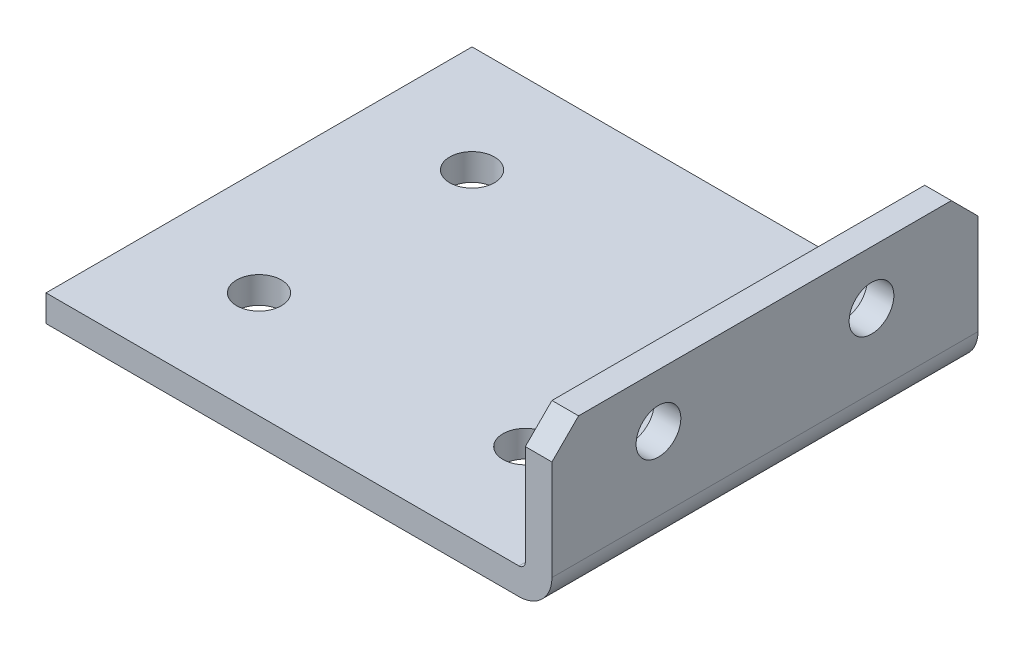
ISO-10303-21;
HEADER;
FILE_DESCRIPTION(('STEP AP214'),'2;1');
FILE_NAME('part.step','',(''),(''),'','','');
FILE_SCHEMA(('AUTOMOTIVE_DESIGN { 1 0 10303 214 1 1 1 1 }'));
ENDSEC;
DATA;
#1=APPLICATION_CONTEXT('core data for automotive mechanical design processes');
#2=APPLICATION_PROTOCOL_DEFINITION('international standard','automotive_design',2000,#1);
#3=PRODUCT_CONTEXT('',#1,'mechanical');
#4=PRODUCT('Part','Part','',(#3));
#5=PRODUCT_RELATED_PRODUCT_CATEGORY('part','',(#4));
#6=PRODUCT_DEFINITION_FORMATION('','',#4);
#7=PRODUCT_DEFINITION_CONTEXT('part definition',#1,'design');
#8=PRODUCT_DEFINITION('design','',#6,#7);
#9=PRODUCT_DEFINITION_SHAPE('','',#8);
#10=(LENGTH_UNIT() NAMED_UNIT(*) SI_UNIT(.MILLI.,.METRE.));
#11=(NAMED_UNIT(*) PLANE_ANGLE_UNIT() SI_UNIT($,.RADIAN.));
#12=(NAMED_UNIT(*) SI_UNIT($,.STERADIAN.) SOLID_ANGLE_UNIT());
#13=UNCERTAINTY_MEASURE_WITH_UNIT(LENGTH_MEASURE(1.E-05),#10,'distance_accuracy_value','');
#14=(GEOMETRIC_REPRESENTATION_CONTEXT(3) GLOBAL_UNCERTAINTY_ASSIGNED_CONTEXT((#13)) GLOBAL_UNIT_ASSIGNED_CONTEXT((#10,
#11,#12)) REPRESENTATION_CONTEXT('',''));
#15=CARTESIAN_POINT('',(0.,0.,0.));
#16=DIRECTION('',(0.,0.,1.));
#17=DIRECTION('',(1.,0.,0.));
#18=AXIS2_PLACEMENT_3D('',#15,#16,#17);
#19=CARTESIAN_POINT('',(85.7250000000001,12.7000000000001,-25.4));
#20=DIRECTION('',(-1.,0.,0.));
#21=DIRECTION('',(0.,-1.,0.));
#22=AXIS2_PLACEMENT_3D('',#19,#20,#21);
#23=CYLINDRICAL_SURFACE('',#22,2.667);
#24=CARTESIAN_POINT('',(85.7250000000001,12.7000000000001,-25.4));
#25=DIRECTION('',(-1.,0.,0.));
#26=DIRECTION('',(0.,-1.,0.));
#27=AXIS2_PLACEMENT_3D('',#24,#25,#26);
#28=CIRCLE('',#27,2.667);
#29=CARTESIAN_POINT('',(85.7250000000001,10.0330000000001,-25.4));
#30=VERTEX_POINT('',#29);
#31=EDGE_CURVE('E128',#30,#30,#28,.F.);
#32=ORIENTED_EDGE('',*,*,#31,.T.);
#33=EDGE_LOOP('',(#32));
#34=FACE_BOUND('',#33,.T.);
#35=CARTESIAN_POINT('',(82.55,12.7000000000001,-25.4));
#36=DIRECTION('',(-1.,0.,0.));
#37=DIRECTION('',(0.,-1.,0.));
#38=AXIS2_PLACEMENT_3D('',#35,#36,#37);
#39=CIRCLE('',#38,2.667);
#40=CARTESIAN_POINT('',(82.55,10.0330000000001,-25.4));
#41=VERTEX_POINT('',#40);
#42=EDGE_CURVE('E136',#41,#41,#39,.F.);
#43=ORIENTED_EDGE('',*,*,#42,.F.);
#44=EDGE_LOOP('',(#43));
#45=FACE_BOUND('',#44,.T.);
#46=ADVANCED_FACE('F34',(#34,#45),#23,.F.);
#47=CARTESIAN_POINT('',(85.7250000000001,12.7000000000001,-50.8));
#48=DIRECTION('',(-1.,0.,0.));
#49=DIRECTION('',(0.,-1.,0.));
#50=AXIS2_PLACEMENT_3D('',#47,#48,#49);
#51=CYLINDRICAL_SURFACE('',#50,2.667);
#52=CARTESIAN_POINT('',(85.7250000000001,12.7000000000001,-50.8));
#53=DIRECTION('',(-1.,0.,0.));
#54=DIRECTION('',(0.,-1.,0.));
#55=AXIS2_PLACEMENT_3D('',#52,#53,#54);
#56=CIRCLE('',#55,2.667);
#57=CARTESIAN_POINT('',(85.7250000000001,10.0330000000001,-50.8));
#58=VERTEX_POINT('',#57);
#59=EDGE_CURVE('E125',#58,#58,#56,.F.);
#60=ORIENTED_EDGE('',*,*,#59,.T.);
#61=EDGE_LOOP('',(#60));
#62=FACE_BOUND('',#61,.T.);
#63=CARTESIAN_POINT('',(82.55,12.7000000000001,-50.8));
#64=DIRECTION('',(-1.,0.,0.));
#65=DIRECTION('',(0.,-1.,0.));
#66=AXIS2_PLACEMENT_3D('',#63,#64,#65);
#67=CIRCLE('',#66,2.667);
#68=CARTESIAN_POINT('',(82.55,10.0330000000001,-50.8));
#69=VERTEX_POINT('',#68);
#70=EDGE_CURVE('E132',#69,#69,#67,.F.);
#71=ORIENTED_EDGE('',*,*,#70,.F.);
#72=EDGE_LOOP('',(#71));
#73=FACE_BOUND('',#72,.T.);
#74=ADVANCED_FACE('F300',(#62,#73),#51,.F.);
#75=CARTESIAN_POINT('',(85.7250000000001,19.05,0.));
#76=DIRECTION('',(0.,-1.,0.));
#77=DIRECTION('',(1.,0.,0.));
#78=AXIS2_PLACEMENT_3D('',#75,#76,#77);
#79=PLANE('',#78);
#80=DIRECTION('',(1.,0.,0.));
#81=VECTOR('',#80,1.);
#82=CARTESIAN_POINT('',(85.7250000000001,19.05,-60.325));
#83=LINE('',#82,#81);
#84=CARTESIAN_POINT('',(85.7250000000001,19.05,-60.325));
#85=VERTEX_POINT('',#84);
#86=CARTESIAN_POINT('',(82.5500000000001,19.05,-60.325));
#87=VERTEX_POINT('',#86);
#88=EDGE_CURVE('E184',#85,#87,#83,.F.);
#89=ORIENTED_EDGE('',*,*,#88,.T.);
#90=DIRECTION('',(0.,0.,1.));
#91=VECTOR('',#90,1.);
#92=CARTESIAN_POINT('',(82.5500000000001,19.05,0.));
#93=LINE('',#92,#91);
#94=CARTESIAN_POINT('',(82.55,19.05,-15.875));
#95=VERTEX_POINT('',#94);
#96=EDGE_CURVE('E142',#95,#87,#93,.F.);
#97=ORIENTED_EDGE('',*,*,#96,.F.);
#98=DIRECTION('',(1.,0.,0.));
#99=VECTOR('',#98,1.);
#100=CARTESIAN_POINT('',(85.7250000000001,19.05,-15.875));
#101=LINE('',#100,#99);
#102=CARTESIAN_POINT('',(85.7250000000001,19.05,-15.875));
#103=VERTEX_POINT('',#102);
#104=EDGE_CURVE('E135',#95,#103,#101,.T.);
#105=ORIENTED_EDGE('',*,*,#104,.T.);
#106=DIRECTION('',(0.,0.,1.));
#107=VECTOR('',#106,1.);
#108=CARTESIAN_POINT('',(85.7250000000001,19.05,0.));
#109=LINE('',#108,#107);
#110=EDGE_CURVE('E156',#103,#85,#109,.F.);
#111=ORIENTED_EDGE('',*,*,#110,.T.);
#112=EDGE_LOOP('',(#89,#97,#105,#111));
#113=FACE_BOUND('',#112,.T.);
#114=ADVANCED_FACE('F297',(#113),#79,.F.);
#115=CARTESIAN_POINT('',(85.7250000000001,19.05,-60.325));
#116=DIRECTION('',(0.,-0.707106781186548,0.707106781186548));
#117=DIRECTION('',(0.,-0.707106781186548,-0.707106781186548));
#118=AXIS2_PLACEMENT_3D('',#115,#116,#117);
#119=PLANE('',#118);
#120=DIRECTION('',(1.,0.,0.));
#121=VECTOR('',#120,1.);
#122=CARTESIAN_POINT('',(85.7250000000001,15.875,-63.5));
#123=LINE('',#122,#121);
#124=CARTESIAN_POINT('',(85.725,15.875,-63.5));
#125=VERTEX_POINT('',#124);
#126=CARTESIAN_POINT('',(82.55,15.875,-63.5));
#127=VERTEX_POINT('',#126);
#128=EDGE_CURVE('E145',#125,#127,#123,.F.);
#129=ORIENTED_EDGE('',*,*,#128,.T.);
#130=DIRECTION('',(0.,-0.707106781186545,-0.70710678118655));
#131=VECTOR('',#130,1.);
#132=CARTESIAN_POINT('',(82.5500000000001,19.05,-60.325));
#133=LINE('',#132,#131);
#134=EDGE_CURVE('E206',#87,#127,#133,.T.);
#135=ORIENTED_EDGE('',*,*,#134,.F.);
#136=ORIENTED_EDGE('',*,*,#88,.F.);
#137=DIRECTION('',(0.,-0.707106781186546,-0.707106781186549));
#138=VECTOR('',#137,1.);
#139=CARTESIAN_POINT('',(85.7250000000001,19.05,-60.325));
#140=LINE('',#139,#138);
#141=EDGE_CURVE('E175',#85,#125,#140,.T.);
#142=ORIENTED_EDGE('',*,*,#141,.T.);
#143=EDGE_LOOP('',(#129,#135,#136,#142));
#144=FACE_BOUND('',#143,.T.);
#145=ADVANCED_FACE('F293',(#144),#119,.F.);
#146=CARTESIAN_POINT('',(81.788,3.937,-63.5));
#147=DIRECTION('',(0.,0.,-1.));
#148=DIRECTION('',(-1.,0.,0.));
#149=AXIS2_PLACEMENT_3D('',#146,#147,#148);
#150=CYLINDRICAL_SURFACE('',#149,0.761999999999999);
#151=CARTESIAN_POINT('',(81.788,3.937,-12.7));
#152=DIRECTION('',(0.,0.,-1.));
#153=DIRECTION('',(-1.,0.,0.));
#154=AXIS2_PLACEMENT_3D('',#151,#152,#153);
#155=CIRCLE('',#154,0.761999999999999);
#156=CARTESIAN_POINT('',(82.55,3.937,-12.7));
#157=VERTEX_POINT('',#156);
#158=CARTESIAN_POINT('',(81.788,3.175,-12.7));
#159=VERTEX_POINT('',#158);
#160=EDGE_CURVE('E143',#157,#159,#155,.T.);
#161=ORIENTED_EDGE('',*,*,#160,.F.);
#162=DIRECTION('',(0.,0.,1.));
#163=VECTOR('',#162,1.);
#164=CARTESIAN_POINT('',(82.55,3.937,0.));
#165=LINE('',#164,#163);
#166=CARTESIAN_POINT('',(82.55,3.93699999999999,-63.5));
#167=VERTEX_POINT('',#166);
#168=EDGE_CURVE('E139',#167,#157,#165,.T.);
#169=ORIENTED_EDGE('',*,*,#168,.F.);
#170=CARTESIAN_POINT('',(81.788,3.937,-63.5));
#171=DIRECTION('',(0.,0.,-1.));
#172=DIRECTION('',(-1.,0.,0.));
#173=AXIS2_PLACEMENT_3D('',#170,#171,#172);
#174=CIRCLE('',#173,0.761999999999999);
#175=CARTESIAN_POINT('',(81.788,3.175,-63.5));
#176=VERTEX_POINT('',#175);
#177=EDGE_CURVE('E140',#167,#176,#174,.T.);
#178=ORIENTED_EDGE('',*,*,#177,.T.);
#179=DIRECTION('',(0.,0.,-1.));
#180=VECTOR('',#179,1.);
#181=CARTESIAN_POINT('',(81.788,3.175,-63.5));
#182=LINE('',#181,#180);
#183=EDGE_CURVE('E170',#176,#159,#182,.F.);
#184=ORIENTED_EDGE('',*,*,#183,.T.);
#185=EDGE_LOOP('',(#161,#169,#178,#184));
#186=FACE_BOUND('',#185,.T.);
#187=ADVANCED_FACE('F289',(#186),#150,.F.);
#188=CARTESIAN_POINT('',(82.5500000000001,19.05,0.));
#189=DIRECTION('',(-1.,0.,0.));
#190=DIRECTION('',(0.,-1.,0.));
#191=AXIS2_PLACEMENT_3D('',#188,#189,#190);
#192=PLANE('',#191);
#193=ORIENTED_EDGE('',*,*,#70,.T.);
#194=EDGE_LOOP('',(#193));
#195=FACE_BOUND('',#194,.T.);
#196=ORIENTED_EDGE('',*,*,#42,.T.);
#197=EDGE_LOOP('',(#196));
#198=FACE_BOUND('',#197,.T.);
#199=DIRECTION('',(0.,1.,0.));
#200=VECTOR('',#199,1.);
#201=CARTESIAN_POINT('',(82.55,0.,-12.7));
#202=LINE('',#201,#200);
#203=CARTESIAN_POINT('',(82.55,15.875,-12.7));
#204=VERTEX_POINT('',#203);
#205=EDGE_CURVE('E119',#157,#204,#202,.T.);
#206=ORIENTED_EDGE('',*,*,#205,.T.);
#207=DIRECTION('',(0.,0.707106781186549,-0.707106781186546));
#208=VECTOR('',#207,1.);
#209=CARTESIAN_POINT('',(82.55,19.05,-15.875));
#210=LINE('',#209,#208);
#211=EDGE_CURVE('E131',#204,#95,#210,.T.);
#212=ORIENTED_EDGE('',*,*,#211,.T.);
#213=ORIENTED_EDGE('',*,*,#96,.T.);
#214=ORIENTED_EDGE('',*,*,#134,.T.);
#215=DIRECTION('',(0.,-1.,0.));
#216=VECTOR('',#215,1.);
#217=CARTESIAN_POINT('',(82.5500000000001,19.05,-63.5));
#218=LINE('',#217,#216);
#219=EDGE_CURVE('E169',#127,#167,#218,.T.);
#220=ORIENTED_EDGE('',*,*,#219,.T.);
#221=ORIENTED_EDGE('',*,*,#168,.T.);
#222=EDGE_LOOP('',(#206,#212,#213,#214,#220,#221));
#223=FACE_BOUND('',#222,.T.);
#224=ADVANCED_FACE('F285',(#195,#198,#223),#192,.T.);
#225=CARTESIAN_POINT('',(85.7250000000001,19.05,-15.875));
#226=DIRECTION('',(0.,-0.707106781186546,-0.707106781186549));
#227=DIRECTION('',(0.,0.707106781186549,-0.707106781186546));
#228=AXIS2_PLACEMENT_3D('',#225,#226,#227);
#229=PLANE('',#228);
#230=DIRECTION('',(-1.,0.,0.));
#231=VECTOR('',#230,1.);
#232=CARTESIAN_POINT('',(-9.42940188980387,15.875,-12.7));
#233=LINE('',#232,#231);
#234=CARTESIAN_POINT('',(85.725,15.875,-12.7));
#235=VERTEX_POINT('',#234);
#236=EDGE_CURVE('E111',#204,#235,#233,.F.);
#237=ORIENTED_EDGE('',*,*,#236,.T.);
#238=DIRECTION('',(0.,0.707106781186549,-0.707106781186546));
#239=VECTOR('',#238,1.);
#240=CARTESIAN_POINT('',(85.725,15.875,-12.7));
#241=LINE('',#240,#239);
#242=EDGE_CURVE('E107',#235,#103,#241,.T.);
#243=ORIENTED_EDGE('',*,*,#242,.T.);
#244=ORIENTED_EDGE('',*,*,#104,.F.);
#245=ORIENTED_EDGE('',*,*,#211,.F.);
#246=EDGE_LOOP('',(#237,#243,#244,#245));
#247=FACE_BOUND('',#246,.T.);
#248=ADVANCED_FACE('F282',(#247),#229,.F.);
#249=CARTESIAN_POINT('',(85.7250000000001,19.05,0.));
#250=DIRECTION('',(-1.,0.,0.));
#251=DIRECTION('',(0.,-1.,0.));
#252=AXIS2_PLACEMENT_3D('',#249,#250,#251);
#253=PLANE('',#252);
#254=ORIENTED_EDGE('',*,*,#141,.F.);
#255=ORIENTED_EDGE('',*,*,#110,.F.);
#256=ORIENTED_EDGE('',*,*,#242,.F.);
#257=DIRECTION('',(0.,1.,0.));
#258=VECTOR('',#257,1.);
#259=CARTESIAN_POINT('',(85.725,0.,-12.7));
#260=LINE('',#259,#258);
#261=CARTESIAN_POINT('',(85.725,3.93699999999999,-12.7));
#262=VERTEX_POINT('',#261);
#263=EDGE_CURVE('E101',#235,#262,#260,.F.);
#264=ORIENTED_EDGE('',*,*,#263,.T.);
#265=DIRECTION('',(0.,0.,-1.));
#266=VECTOR('',#265,1.);
#267=CARTESIAN_POINT('',(85.725,3.93699999999999,-63.5));
#268=LINE('',#267,#266);
#269=CARTESIAN_POINT('',(85.725,3.93699999999999,-63.5));
#270=VERTEX_POINT('',#269);
#271=EDGE_CURVE('E91',#270,#262,#268,.F.);
#272=ORIENTED_EDGE('',*,*,#271,.F.);
#273=DIRECTION('',(0.,-1.,0.));
#274=VECTOR('',#273,1.);
#275=CARTESIAN_POINT('',(85.7250000000001,19.05,-63.5));
#276=LINE('',#275,#274);
#277=EDGE_CURVE('E172',#125,#270,#276,.T.);
#278=ORIENTED_EDGE('',*,*,#277,.F.);
#279=EDGE_LOOP('',(#254,#255,#256,#264,#272,#278));
#280=FACE_BOUND('',#279,.T.);
#281=ORIENTED_EDGE('',*,*,#59,.F.);
#282=EDGE_LOOP('',(#281));
#283=FACE_BOUND('',#282,.T.);
#284=ORIENTED_EDGE('',*,*,#31,.F.);
#285=EDGE_LOOP('',(#284));
#286=FACE_BOUND('',#285,.T.);
#287=ADVANCED_FACE('F103',(#280,#283,#286),#253,.F.);
#288=CARTESIAN_POINT('',(0.,3.175,-63.5));
#289=DIRECTION('',(0.,-1.,0.));
#290=DIRECTION('',(0.,0.,-1.));
#291=AXIS2_PLACEMENT_3D('',#288,#289,#290);
#292=PLANE('',#291);
#293=DIRECTION('',(1.,0.,0.));
#294=VECTOR('',#293,1.);
#295=CARTESIAN_POINT('',(0.,3.175,-63.5));
#296=LINE('',#295,#294);
#297=CARTESIAN_POINT('',(25.4,3.175,-63.5));
#298=VERTEX_POINT('',#297);
#299=EDGE_CURVE('E124',#176,#298,#296,.F.);
#300=ORIENTED_EDGE('',*,*,#299,.T.);
#301=DIRECTION('',(0.,0.,-1.));
#302=VECTOR('',#301,1.);
#303=CARTESIAN_POINT('',(25.4,3.175,-63.5));
#304=LINE('',#303,#302);
#305=CARTESIAN_POINT('',(25.4,3.175,-12.7));
#306=VERTEX_POINT('',#305);
#307=EDGE_CURVE('E344',#306,#298,#304,.T.);
#308=ORIENTED_EDGE('',*,*,#307,.F.);
#309=DIRECTION('',(-1.,0.,0.));
#310=VECTOR('',#309,1.);
#311=CARTESIAN_POINT('',(-9.42940188980387,3.175,-12.7));
#312=LINE('',#311,#310);
#313=EDGE_CURVE('E37',#306,#159,#312,.F.);
#314=ORIENTED_EDGE('',*,*,#313,.T.);
#315=ORIENTED_EDGE('',*,*,#183,.F.);
#316=EDGE_LOOP('',(#300,#308,#314,#315));
#317=FACE_BOUND('',#316,.T.);
#318=CARTESIAN_POINT('',(69.85,3.175,-50.8));
#319=DIRECTION('',(0.,1.,0.));
#320=DIRECTION('',(0.,0.,1.));
#321=AXIS2_PLACEMENT_3D('',#318,#319,#320);
#322=CIRCLE('',#321,2.667);
#323=CARTESIAN_POINT('',(69.85,3.175,-48.133));
#324=VERTEX_POINT('',#323);
#325=EDGE_CURVE('E149',#324,#324,#322,.F.);
#326=ORIENTED_EDGE('',*,*,#325,.T.);
#327=EDGE_LOOP('',(#326));
#328=FACE_BOUND('',#327,.T.);
#329=CARTESIAN_POINT('',(69.85,3.175,-25.4));
#330=DIRECTION('',(0.,1.,0.));
#331=DIRECTION('',(0.,0.,1.));
#332=AXIS2_PLACEMENT_3D('',#329,#330,#331);
#333=CIRCLE('',#332,2.667);
#334=CARTESIAN_POINT('',(69.85,3.175,-22.733));
#335=VERTEX_POINT('',#334);
#336=EDGE_CURVE('E229',#335,#335,#333,.F.);
#337=ORIENTED_EDGE('',*,*,#336,.T.);
#338=EDGE_LOOP('',(#337));
#339=FACE_BOUND('',#338,.T.);
#340=CARTESIAN_POINT('',(38.1,3.175,-50.8));
#341=DIRECTION('',(0.,1.,0.));
#342=DIRECTION('',(0.,0.,1.));
#343=AXIS2_PLACEMENT_3D('',#340,#341,#342);
#344=CIRCLE('',#343,2.667);
#345=CARTESIAN_POINT('',(38.1,3.175,-48.133));
#346=VERTEX_POINT('',#345);
#347=EDGE_CURVE('E231',#346,#346,#344,.F.);
#348=ORIENTED_EDGE('',*,*,#347,.T.);
#349=EDGE_LOOP('',(#348));
#350=FACE_BOUND('',#349,.T.);
#351=CARTESIAN_POINT('',(38.1,3.175,-25.4));
#352=DIRECTION('',(0.,1.,0.));
#353=DIRECTION('',(0.,0.,1.));
#354=AXIS2_PLACEMENT_3D('',#351,#352,#353);
#355=CIRCLE('',#354,2.667);
#356=CARTESIAN_POINT('',(38.1,3.175,-22.733));
#357=VERTEX_POINT('',#356);
#358=EDGE_CURVE('E110',#357,#357,#355,.F.);
#359=ORIENTED_EDGE('',*,*,#358,.T.);
#360=EDGE_LOOP('',(#359));
#361=FACE_BOUND('',#360,.T.);
#362=ADVANCED_FACE('F238',(#317,#328,#339,#350,#361),#292,.F.);
#363=CARTESIAN_POINT('',(0.,3.175,-63.5));
#364=DIRECTION('',(0.,0.,1.));
#365=DIRECTION('',(1.,0.,0.));
#366=AXIS2_PLACEMENT_3D('',#363,#364,#365);
#367=PLANE('',#366);
#368=DIRECTION('',(1.,0.,0.));
#369=VECTOR('',#368,1.);
#370=CARTESIAN_POINT('',(0.,0.,-63.5));
#371=LINE('',#370,#369);
#372=CARTESIAN_POINT('',(25.4,0.,-63.5));
#373=VERTEX_POINT('',#372);
#374=CARTESIAN_POINT('',(81.788,0.,-63.5));
#375=VERTEX_POINT('',#374);
#376=EDGE_CURVE('E146',#373,#375,#371,.T.);
#377=ORIENTED_EDGE('',*,*,#376,.F.);
#378=DIRECTION('',(0.,1.,0.));
#379=VECTOR('',#378,1.);
#380=CARTESIAN_POINT('',(25.4,-0.000103077640675135,-63.5));
#381=LINE('',#380,#379);
#382=EDGE_CURVE('E49',#373,#298,#381,.T.);
#383=ORIENTED_EDGE('',*,*,#382,.T.);
#384=ORIENTED_EDGE('',*,*,#299,.F.);
#385=ORIENTED_EDGE('',*,*,#177,.F.);
#386=ORIENTED_EDGE('',*,*,#219,.F.);
#387=ORIENTED_EDGE('',*,*,#128,.F.);
#388=ORIENTED_EDGE('',*,*,#277,.T.);
#389=CARTESIAN_POINT('',(81.788,3.937,-63.5));
#390=DIRECTION('',(0.,0.,-1.));
#391=DIRECTION('',(-1.,0.,0.));
#392=AXIS2_PLACEMENT_3D('',#389,#390,#391);
#393=CIRCLE('',#392,3.937);
#394=EDGE_CURVE('E95',#375,#270,#393,.F.);
#395=ORIENTED_EDGE('',*,*,#394,.F.);
#396=EDGE_LOOP('',(#377,#383,#384,#385,#386,#387,#388,#395));
#397=FACE_BOUND('',#396,.T.);
#398=ADVANCED_FACE('F274',(#397),#367,.F.);
#399=CARTESIAN_POINT('',(81.788,3.937,-63.5));
#400=DIRECTION('',(0.,0.,-1.));
#401=DIRECTION('',(-1.,0.,0.));
#402=AXIS2_PLACEMENT_3D('',#399,#400,#401);
#403=CYLINDRICAL_SURFACE('',#402,3.937);
#404=ORIENTED_EDGE('',*,*,#394,.T.);
#405=ORIENTED_EDGE('',*,*,#271,.T.);
#406=CARTESIAN_POINT('',(81.788,3.937,-12.7));
#407=DIRECTION('',(0.,0.,-1.));
#408=DIRECTION('',(-1.,0.,0.));
#409=AXIS2_PLACEMENT_3D('',#406,#407,#408);
#410=CIRCLE('',#409,3.937);
#411=CARTESIAN_POINT('',(81.788,0.,-12.7));
#412=VERTEX_POINT('',#411);
#413=EDGE_CURVE('E58',#262,#412,#410,.T.);
#414=ORIENTED_EDGE('',*,*,#413,.T.);
#415=DIRECTION('',(0.,0.,-1.));
#416=VECTOR('',#415,1.);
#417=CARTESIAN_POINT('',(81.788,0.,-63.5));
#418=LINE('',#417,#416);
#419=EDGE_CURVE('E148',#375,#412,#418,.F.);
#420=ORIENTED_EDGE('',*,*,#419,.F.);
#421=EDGE_LOOP('',(#404,#405,#414,#420));
#422=FACE_BOUND('',#421,.T.);
#423=ADVANCED_FACE('F93',(#422),#403,.T.);
#424=CARTESIAN_POINT('',(-9.42940188980387,0.,-12.7));
#425=DIRECTION('',(0.,0.,-1.));
#426=DIRECTION('',(-1.,0.,0.));
#427=AXIS2_PLACEMENT_3D('',#424,#425,#426);
#428=PLANE('',#427);
#429=ORIENTED_EDGE('',*,*,#313,.F.);
#430=DIRECTION('',(0.,1.,0.));
#431=VECTOR('',#430,1.);
#432=CARTESIAN_POINT('',(25.4,-0.000103077640675135,-12.7));
#433=LINE('',#432,#431);
#434=CARTESIAN_POINT('',(25.4,0.,-12.7));
#435=VERTEX_POINT('',#434);
#436=EDGE_CURVE('E193',#435,#306,#433,.T.);
#437=ORIENTED_EDGE('',*,*,#436,.F.);
#438=DIRECTION('',(1.,0.,0.));
#439=VECTOR('',#438,1.);
#440=CARTESIAN_POINT('',(0.,0.,-12.7));
#441=LINE('',#440,#439);
#442=EDGE_CURVE('E116',#412,#435,#441,.F.);
#443=ORIENTED_EDGE('',*,*,#442,.F.);
#444=ORIENTED_EDGE('',*,*,#413,.F.);
#445=ORIENTED_EDGE('',*,*,#263,.F.);
#446=ORIENTED_EDGE('',*,*,#236,.F.);
#447=ORIENTED_EDGE('',*,*,#205,.F.);
#448=ORIENTED_EDGE('',*,*,#160,.T.);
#449=EDGE_LOOP('',(#429,#437,#443,#444,#445,#446,#447,#448));
#450=FACE_BOUND('',#449,.T.);
#451=ADVANCED_FACE('F113',(#450),#428,.F.);
#452=CARTESIAN_POINT('',(38.1,0.,-25.4));
#453=DIRECTION('',(0.,1.,0.));
#454=DIRECTION('',(0.,0.,1.));
#455=AXIS2_PLACEMENT_3D('',#452,#453,#454);
#456=CYLINDRICAL_SURFACE('',#455,2.667);
#457=ORIENTED_EDGE('',*,*,#358,.F.);
#458=EDGE_LOOP('',(#457));
#459=FACE_BOUND('',#458,.T.);
#460=CARTESIAN_POINT('',(38.1,0.,-25.4));
#461=DIRECTION('',(0.,1.,0.));
#462=DIRECTION('',(0.,0.,1.));
#463=AXIS2_PLACEMENT_3D('',#460,#461,#462);
#464=CIRCLE('',#463,2.667);
#465=CARTESIAN_POINT('',(38.1,0.,-22.733));
#466=VERTEX_POINT('',#465);
#467=EDGE_CURVE('E224',#466,#466,#464,.T.);
#468=ORIENTED_EDGE('',*,*,#467,.F.);
#469=EDGE_LOOP('',(#468));
#470=FACE_BOUND('',#469,.T.);
#471=ADVANCED_FACE('F240',(#459,#470),#456,.F.);
#472=CARTESIAN_POINT('',(38.1,0.,-50.8));
#473=DIRECTION('',(0.,1.,0.));
#474=DIRECTION('',(0.,0.,1.));
#475=AXIS2_PLACEMENT_3D('',#472,#473,#474);
#476=CYLINDRICAL_SURFACE('',#475,2.667);
#477=ORIENTED_EDGE('',*,*,#347,.F.);
#478=EDGE_LOOP('',(#477));
#479=FACE_BOUND('',#478,.T.);
#480=CARTESIAN_POINT('',(38.1,0.,-50.8));
#481=DIRECTION('',(0.,1.,0.));
#482=DIRECTION('',(0.,0.,1.));
#483=AXIS2_PLACEMENT_3D('',#480,#481,#482);
#484=CIRCLE('',#483,2.667);
#485=CARTESIAN_POINT('',(38.1,0.,-48.133));
#486=VERTEX_POINT('',#485);
#487=EDGE_CURVE('E221',#486,#486,#484,.T.);
#488=ORIENTED_EDGE('',*,*,#487,.F.);
#489=EDGE_LOOP('',(#488));
#490=FACE_BOUND('',#489,.T.);
#491=ADVANCED_FACE('F243',(#479,#490),#476,.F.);
#492=CARTESIAN_POINT('',(69.85,0.,-25.4));
#493=DIRECTION('',(0.,1.,0.));
#494=DIRECTION('',(0.,0.,1.));
#495=AXIS2_PLACEMENT_3D('',#492,#493,#494);
#496=CYLINDRICAL_SURFACE('',#495,2.667);
#497=ORIENTED_EDGE('',*,*,#336,.F.);
#498=EDGE_LOOP('',(#497));
#499=FACE_BOUND('',#498,.T.);
#500=CARTESIAN_POINT('',(69.85,0.,-25.4));
#501=DIRECTION('',(0.,1.,0.));
#502=DIRECTION('',(0.,0.,1.));
#503=AXIS2_PLACEMENT_3D('',#500,#501,#502);
#504=CIRCLE('',#503,2.667);
#505=CARTESIAN_POINT('',(69.85,0.,-22.733));
#506=VERTEX_POINT('',#505);
#507=EDGE_CURVE('E218',#506,#506,#504,.T.);
#508=ORIENTED_EDGE('',*,*,#507,.F.);
#509=EDGE_LOOP('',(#508));
#510=FACE_BOUND('',#509,.T.);
#511=ADVANCED_FACE('F260',(#499,#510),#496,.F.);
#512=CARTESIAN_POINT('',(69.85,0.,-50.8));
#513=DIRECTION('',(0.,1.,0.));
#514=DIRECTION('',(0.,0.,1.));
#515=AXIS2_PLACEMENT_3D('',#512,#513,#514);
#516=CYLINDRICAL_SURFACE('',#515,2.667);
#517=ORIENTED_EDGE('',*,*,#325,.F.);
#518=EDGE_LOOP('',(#517));
#519=FACE_BOUND('',#518,.T.);
#520=CARTESIAN_POINT('',(69.85,0.,-50.8));
#521=DIRECTION('',(0.,1.,0.));
#522=DIRECTION('',(0.,0.,1.));
#523=AXIS2_PLACEMENT_3D('',#520,#521,#522);
#524=CIRCLE('',#523,2.667);
#525=CARTESIAN_POINT('',(69.85,0.,-48.133));
#526=VERTEX_POINT('',#525);
#527=EDGE_CURVE('E43',#526,#526,#524,.T.);
#528=ORIENTED_EDGE('',*,*,#527,.F.);
#529=EDGE_LOOP('',(#528));
#530=FACE_BOUND('',#529,.T.);
#531=ADVANCED_FACE('F250',(#519,#530),#516,.F.);
#532=CARTESIAN_POINT('',(0.,0.,-63.5));
#533=DIRECTION('',(0.,-1.,0.));
#534=DIRECTION('',(0.,0.,-1.));
#535=AXIS2_PLACEMENT_3D('',#532,#533,#534);
#536=PLANE('',#535);
#537=DIRECTION('',(0.,0.,1.));
#538=VECTOR('',#537,1.);
#539=CARTESIAN_POINT('',(25.4,0.,-63.5));
#540=LINE('',#539,#538);
#541=EDGE_CURVE('E11',#373,#435,#540,.T.);
#542=ORIENTED_EDGE('',*,*,#541,.F.);
#543=ORIENTED_EDGE('',*,*,#376,.T.);
#544=ORIENTED_EDGE('',*,*,#419,.T.);
#545=ORIENTED_EDGE('',*,*,#442,.T.);
#546=EDGE_LOOP('',(#542,#543,#544,#545));
#547=FACE_BOUND('',#546,.T.);
#548=ORIENTED_EDGE('',*,*,#527,.T.);
#549=EDGE_LOOP('',(#548));
#550=FACE_BOUND('',#549,.T.);
#551=ORIENTED_EDGE('',*,*,#507,.T.);
#552=EDGE_LOOP('',(#551));
#553=FACE_BOUND('',#552,.T.);
#554=ORIENTED_EDGE('',*,*,#487,.T.);
#555=EDGE_LOOP('',(#554));
#556=FACE_BOUND('',#555,.T.);
#557=ORIENTED_EDGE('',*,*,#467,.T.);
#558=EDGE_LOOP('',(#557));
#559=FACE_BOUND('',#558,.T.);
#560=ADVANCED_FACE('F247',(#547,#550,#553,#556,#559),#536,.T.);
#561=CARTESIAN_POINT('',(25.4,-0.000103077640675135,-63.5));
#562=DIRECTION('',(1.,0.,0.));
#563=DIRECTION('',(0.,0.,-1.));
#564=AXIS2_PLACEMENT_3D('',#561,#562,#563);
#565=PLANE('',#564);
#566=ORIENTED_EDGE('',*,*,#541,.T.);
#567=ORIENTED_EDGE('',*,*,#436,.T.);
#568=ORIENTED_EDGE('',*,*,#307,.T.);
#569=ORIENTED_EDGE('',*,*,#382,.F.);
#570=EDGE_LOOP('',(#566,#567,#568,#569));
#571=FACE_BOUND('',#570,.T.);
#572=ADVANCED_FACE('F249',(#571),#565,.F.);
#573=CLOSED_SHELL('',(#46,#74,#114,#145,#187,#224,#248,#287,#362,#398,#423,#451,#471,#491,#511,
#531,#560,#572));
#574=MANIFOLD_SOLID_BREP('B2',#573);
#575=ADVANCED_BREP_SHAPE_REPRESENTATION('',(#18,#574),#14);
#576=SHAPE_DEFINITION_REPRESENTATION(#9,#575);
ENDSEC;
END-ISO-10303-21;
